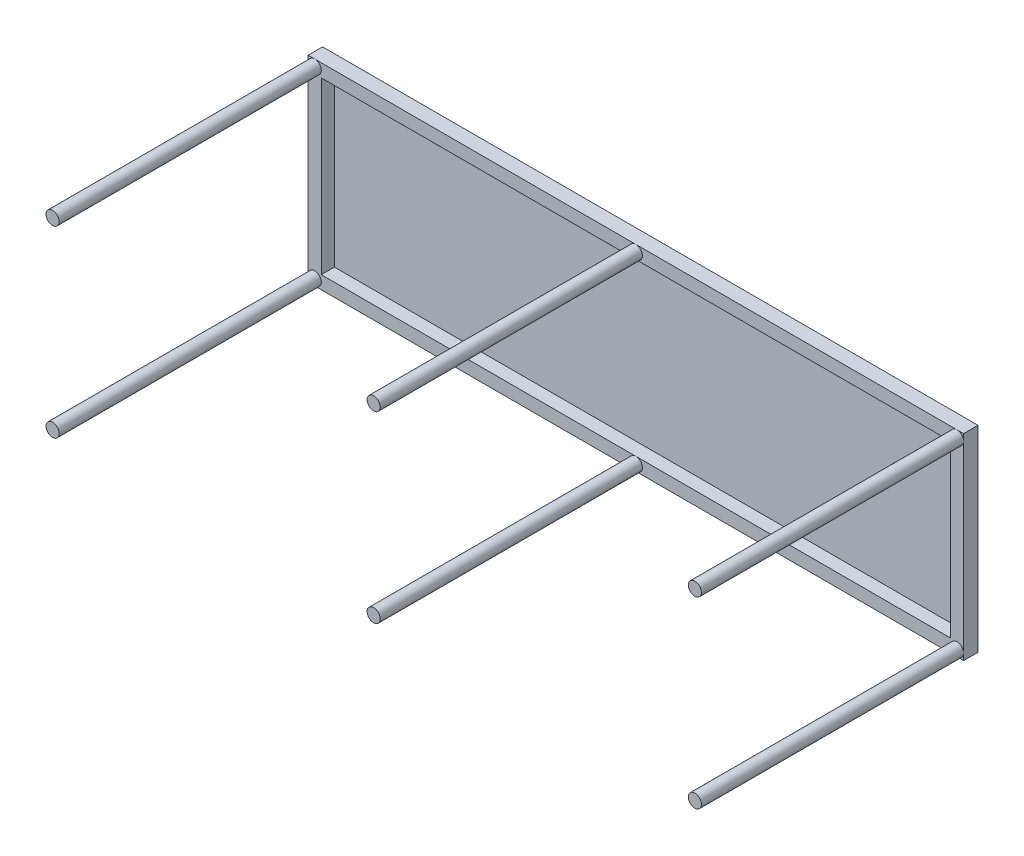
ISO-10303-21;
HEADER;
FILE_DESCRIPTION(('STEP AP214'),'2;1');
FILE_NAME('part.step','',(''),(''),'','','');
FILE_SCHEMA(('AUTOMOTIVE_DESIGN { 1 0 10303 214 1 1 1 1 }'));
ENDSEC;
DATA;
#1=APPLICATION_CONTEXT('core data for automotive mechanical design processes');
#2=APPLICATION_PROTOCOL_DEFINITION('international standard','automotive_design',2000,#1);
#3=PRODUCT_CONTEXT('',#1,'mechanical');
#4=PRODUCT('Part','Part','',(#3));
#5=PRODUCT_RELATED_PRODUCT_CATEGORY('part','',(#4));
#6=PRODUCT_DEFINITION_FORMATION('','',#4);
#7=PRODUCT_DEFINITION_CONTEXT('part definition',#1,'design');
#8=PRODUCT_DEFINITION('design','',#6,#7);
#9=PRODUCT_DEFINITION_SHAPE('','',#8);
#10=(LENGTH_UNIT() NAMED_UNIT(*) SI_UNIT(.MILLI.,.METRE.));
#11=(NAMED_UNIT(*) PLANE_ANGLE_UNIT() SI_UNIT($,.RADIAN.));
#12=(NAMED_UNIT(*) SI_UNIT($,.STERADIAN.) SOLID_ANGLE_UNIT());
#13=UNCERTAINTY_MEASURE_WITH_UNIT(LENGTH_MEASURE(1.E-05),#10,'distance_accuracy_value','');
#14=(GEOMETRIC_REPRESENTATION_CONTEXT(3) GLOBAL_UNCERTAINTY_ASSIGNED_CONTEXT((#13)) GLOBAL_UNIT_ASSIGNED_CONTEXT((#10,
#11,#12)) REPRESENTATION_CONTEXT('',''));
#15=CARTESIAN_POINT('',(0.,0.,0.));
#16=DIRECTION('',(0.,0.,1.));
#17=DIRECTION('',(1.,0.,0.));
#18=AXIS2_PLACEMENT_3D('',#15,#16,#17);
#19=CARTESIAN_POINT('',(0.,0.,110.));
#20=DIRECTION('',(0.,0.,1.));
#21=DIRECTION('',(1.,0.,0.));
#22=AXIS2_PLACEMENT_3D('',#19,#20,#21);
#23=PLANE('',#22);
#24=DIRECTION('',(1.,0.,0.));
#25=VECTOR('',#24,1.);
#26=CARTESIAN_POINT('',(-59.0364120135364,-1472.78417935702,110.));
#27=LINE('',#26,#25);
#28=CARTESIAN_POINT('',(-9.03641201353637,-1472.78417935702,110.));
#29=VERTEX_POINT('',#28);
#30=CARTESIAN_POINT('',(2440.96358798646,-1472.78417935702,110.));
#31=VERTEX_POINT('',#30);
#32=EDGE_CURVE('E144',#29,#31,#27,.T.);
#33=ORIENTED_EDGE('',*,*,#32,.T.);
#34=CARTESIAN_POINT('',(2440.96358798646,-1422.78417935702,110.));
#35=DIRECTION('',(0.,0.,1.));
#36=DIRECTION('',(1.,0.,0.));
#37=AXIS2_PLACEMENT_3D('',#34,#35,#36);
#38=CIRCLE('',#37,50.);
#39=CARTESIAN_POINT('',(2440.96358798646,-1372.78417935702,110.));
#40=VERTEX_POINT('',#39);
#41=EDGE_CURVE('E46',#40,#31,#38,.T.);
#42=ORIENTED_EDGE('',*,*,#41,.F.);
#43=DIRECTION('',(1.,0.,0.));
#44=VECTOR('',#43,1.);
#45=CARTESIAN_POINT('',(40.9635879864636,-1372.78417935702,110.));
#46=LINE('',#45,#44);
#47=CARTESIAN_POINT('',(40.9635879864636,-1372.78417935702,110.));
#48=VERTEX_POINT('',#47);
#49=EDGE_CURVE('E142',#48,#40,#46,.T.);
#50=ORIENTED_EDGE('',*,*,#49,.F.);
#51=DIRECTION('',(0.,-1.,0.));
#52=VECTOR('',#51,1.);
#53=CARTESIAN_POINT('',(40.9635879864636,-72.784179357022,110.));
#54=LINE('',#53,#52);
#55=CARTESIAN_POINT('',(40.9635879864636,-72.784179357022,110.));
#56=VERTEX_POINT('',#55);
#57=EDGE_CURVE('E155',#56,#48,#54,.T.);
#58=ORIENTED_EDGE('',*,*,#57,.F.);
#59=DIRECTION('',(-1.,0.,0.));
#60=VECTOR('',#59,1.);
#61=CARTESIAN_POINT('',(40.9635879864636,-72.784179357022,110.));
#62=LINE('',#61,#60);
#63=CARTESIAN_POINT('',(2440.96358798646,-72.784179357022,110.));
#64=VERTEX_POINT('',#63);
#65=EDGE_CURVE('E162',#64,#56,#62,.T.);
#66=ORIENTED_EDGE('',*,*,#65,.F.);
#67=CARTESIAN_POINT('',(2440.96358798646,-22.784179357022,110.));
#68=DIRECTION('',(0.,0.,1.));
#69=DIRECTION('',(1.,0.,0.));
#70=AXIS2_PLACEMENT_3D('',#67,#68,#69);
#71=CIRCLE('',#70,50.);
#72=CARTESIAN_POINT('',(2440.96358798646,27.215820642978,110.));
#73=VERTEX_POINT('',#72);
#74=EDGE_CURVE('E53',#73,#64,#71,.T.);
#75=ORIENTED_EDGE('',*,*,#74,.F.);
#76=DIRECTION('',(-1.,0.,0.));
#77=VECTOR('',#76,1.);
#78=CARTESIAN_POINT('',(-59.0364120135364,27.215820642978,110.));
#79=LINE('',#78,#77);
#80=CARTESIAN_POINT('',(-9.03641201353637,27.215820642978,110.));
#81=VERTEX_POINT('',#80);
#82=EDGE_CURVE('E209',#73,#81,#79,.T.);
#83=ORIENTED_EDGE('',*,*,#82,.T.);
#84=CARTESIAN_POINT('',(-9.03641201353637,-22.784179357022,110.));
#85=DIRECTION('',(0.,0.,1.));
#86=DIRECTION('',(1.,0.,0.));
#87=AXIS2_PLACEMENT_3D('',#84,#85,#86);
#88=CIRCLE('',#87,50.);
#89=CARTESIAN_POINT('',(-59.0364120135364,-22.784179357022,110.));
#90=VERTEX_POINT('',#89);
#91=EDGE_CURVE('E40',#90,#81,#88,.T.);
#92=ORIENTED_EDGE('',*,*,#91,.F.);
#93=DIRECTION('',(0.,-1.,0.));
#94=VECTOR('',#93,1.);
#95=CARTESIAN_POINT('',(-59.0364120135364,27.215820642978,110.));
#96=LINE('',#95,#94);
#97=CARTESIAN_POINT('',(-59.0364120135364,-1422.78417935702,110.));
#98=VERTEX_POINT('',#97);
#99=EDGE_CURVE('E193',#90,#98,#96,.T.);
#100=ORIENTED_EDGE('',*,*,#99,.T.);
#101=CARTESIAN_POINT('',(-9.03641201353637,-1422.78417935702,110.));
#102=DIRECTION('',(0.,0.,1.));
#103=DIRECTION('',(1.,0.,0.));
#104=AXIS2_PLACEMENT_3D('',#101,#102,#103);
#105=CIRCLE('',#104,50.);
#106=EDGE_CURVE('E11',#98,#29,#105,.F.);
#107=ORIENTED_EDGE('',*,*,#106,.T.);
#108=EDGE_LOOP('',(#33,#42,#50,#58,#66,#75,#83,#92,#100,#107));
#109=FACE_BOUND('',#108,.T.);
#110=ADVANCED_FACE('F32',(#109),#23,.T.);
#111=CARTESIAN_POINT('',(4840.96358798646,-1372.78417935702,110.));
#112=VERTEX_POINT('',#111);
#113=EDGE_CURVE('E147',#40,#112,#46,.T.);
#114=ORIENTED_EDGE('',*,*,#113,.F.);
#115=EDGE_CURVE('E130',#31,#40,#38,.T.);
#116=ORIENTED_EDGE('',*,*,#115,.F.);
#117=CARTESIAN_POINT('',(4890.96358798646,-1472.78417935702,110.));
#118=VERTEX_POINT('',#117);
#119=EDGE_CURVE('E198',#31,#118,#27,.T.);
#120=ORIENTED_EDGE('',*,*,#119,.T.);
#121=CARTESIAN_POINT('',(4890.96358798646,-1422.78417935702,110.));
#122=DIRECTION('',(0.,0.,1.));
#123=DIRECTION('',(1.,0.,0.));
#124=AXIS2_PLACEMENT_3D('',#121,#122,#123);
#125=CIRCLE('',#124,50.);
#126=CARTESIAN_POINT('',(4940.96358798646,-1422.78417935702,110.));
#127=VERTEX_POINT('',#126);
#128=EDGE_CURVE('E247',#127,#118,#125,.T.);
#129=ORIENTED_EDGE('',*,*,#128,.F.);
#130=DIRECTION('',(0.,1.,0.));
#131=VECTOR('',#130,1.);
#132=CARTESIAN_POINT('',(4940.96358798646,27.215820642978,110.));
#133=LINE('',#132,#131);
#134=CARTESIAN_POINT('',(4940.96358798646,-22.784179357022,110.));
#135=VERTEX_POINT('',#134);
#136=EDGE_CURVE('E203',#127,#135,#133,.T.);
#137=ORIENTED_EDGE('',*,*,#136,.T.);
#138=CARTESIAN_POINT('',(4890.96358798646,-22.784179357022,110.));
#139=DIRECTION('',(0.,0.,1.));
#140=DIRECTION('',(1.,0.,0.));
#141=AXIS2_PLACEMENT_3D('',#138,#139,#140);
#142=CIRCLE('',#141,50.);
#143=CARTESIAN_POINT('',(4890.96358798646,27.215820642978,110.));
#144=VERTEX_POINT('',#143);
#145=EDGE_CURVE('E256',#144,#135,#142,.T.);
#146=ORIENTED_EDGE('',*,*,#145,.F.);
#147=EDGE_CURVE('E208',#144,#73,#79,.T.);
#148=ORIENTED_EDGE('',*,*,#147,.T.);
#149=EDGE_CURVE('E263',#64,#73,#71,.T.);
#150=ORIENTED_EDGE('',*,*,#149,.F.);
#151=CARTESIAN_POINT('',(4840.96358798646,-72.784179357022,110.));
#152=VERTEX_POINT('',#151);
#153=EDGE_CURVE('E167',#152,#64,#62,.T.);
#154=ORIENTED_EDGE('',*,*,#153,.F.);
#155=DIRECTION('',(0.,1.,0.));
#156=VECTOR('',#155,1.);
#157=CARTESIAN_POINT('',(4840.96358798646,-72.784179357022,110.));
#158=LINE('',#157,#156);
#159=EDGE_CURVE('E151',#112,#152,#158,.T.);
#160=ORIENTED_EDGE('',*,*,#159,.F.);
#161=EDGE_LOOP('',(#114,#116,#120,#129,#137,#146,#148,#150,#154,#160));
#162=FACE_BOUND('',#161,.T.);
#163=ADVANCED_FACE('F148',(#162),#23,.T.);
#164=CARTESIAN_POINT('',(4940.96358798646,27.215820642978,110.));
#165=VERTEX_POINT('',#164);
#166=EDGE_CURVE('E204',#165,#144,#79,.T.);
#167=ORIENTED_EDGE('',*,*,#166,.T.);
#168=EDGE_CURVE('E253',#135,#144,#142,.T.);
#169=ORIENTED_EDGE('',*,*,#168,.F.);
#170=EDGE_CURVE('E197',#135,#165,#133,.T.);
#171=ORIENTED_EDGE('',*,*,#170,.T.);
#172=EDGE_LOOP('',(#167,#169,#171));
#173=FACE_BOUND('',#172,.T.);
#174=ADVANCED_FACE('F308',(#173),#23,.T.);
#175=CARTESIAN_POINT('',(4940.96358798646,-1472.78417935702,110.));
#176=VERTEX_POINT('',#175);
#177=EDGE_CURVE('E199',#176,#127,#133,.T.);
#178=ORIENTED_EDGE('',*,*,#177,.T.);
#179=EDGE_CURVE('E250',#118,#127,#125,.T.);
#180=ORIENTED_EDGE('',*,*,#179,.F.);
#181=EDGE_CURVE('E192',#118,#176,#27,.T.);
#182=ORIENTED_EDGE('',*,*,#181,.T.);
#183=EDGE_LOOP('',(#178,#180,#182));
#184=FACE_BOUND('',#183,.T.);
#185=ADVANCED_FACE('F297',(#184),#23,.T.);
#186=CARTESIAN_POINT('',(-59.0364120135364,-1472.78417935702,110.));
#187=VERTEX_POINT('',#186);
#188=EDGE_CURVE('E194',#187,#29,#27,.T.);
#189=ORIENTED_EDGE('',*,*,#188,.T.);
#190=CARTESIAN_POINT('',(-9.03641201353637,-1422.78417935702,110.));
#191=DIRECTION('',(0.,0.,1.));
#192=DIRECTION('',(1.,0.,0.));
#193=AXIS2_PLACEMENT_3D('',#190,#191,#192);
#194=CIRCLE('',#193,50.);
#195=EDGE_CURVE('E240',#98,#29,#194,.T.);
#196=ORIENTED_EDGE('',*,*,#195,.F.);
#197=EDGE_CURVE('E188',#98,#187,#96,.T.);
#198=ORIENTED_EDGE('',*,*,#197,.T.);
#199=EDGE_LOOP('',(#189,#196,#198));
#200=FACE_BOUND('',#199,.T.);
#201=ADVANCED_FACE('F291',(#200),#23,.T.);
#202=EDGE_CURVE('E232',#81,#90,#88,.T.);
#203=ORIENTED_EDGE('',*,*,#202,.F.);
#204=CARTESIAN_POINT('',(-59.0364120135364,27.215820642978,110.));
#205=VERTEX_POINT('',#204);
#206=EDGE_CURVE('E202',#81,#205,#79,.T.);
#207=ORIENTED_EDGE('',*,*,#206,.T.);
#208=EDGE_CURVE('E189',#205,#90,#96,.T.);
#209=ORIENTED_EDGE('',*,*,#208,.T.);
#210=EDGE_LOOP('',(#203,#207,#209));
#211=FACE_BOUND('',#210,.T.);
#212=ADVANCED_FACE('F281',(#211),#23,.T.);
#213=CARTESIAN_POINT('',(-59.0364120135364,27.215820642978,10.));
#214=DIRECTION('',(1.,0.,0.));
#215=DIRECTION('',(0.,1.,0.));
#216=AXIS2_PLACEMENT_3D('',#213,#214,#215);
#217=PLANE('',#216);
#218=DIRECTION('',(0.,-1.,0.));
#219=VECTOR('',#218,1.);
#220=CARTESIAN_POINT('',(-59.0364120135364,27.215820642978,0.));
#221=LINE('',#220,#219);
#222=CARTESIAN_POINT('',(-59.0364120135364,27.215820642978,0.));
#223=VERTEX_POINT('',#222);
#224=CARTESIAN_POINT('',(-59.0364120135362,-1472.78417935702,0.));
#225=VERTEX_POINT('',#224);
#226=EDGE_CURVE('E207',#223,#225,#221,.T.);
#227=ORIENTED_EDGE('',*,*,#226,.T.);
#228=DIRECTION('',(0.,0.,-1.));
#229=VECTOR('',#228,1.);
#230=CARTESIAN_POINT('',(-59.0364120135362,-1472.78417935702,10.));
#231=LINE('',#230,#229);
#232=EDGE_CURVE('E226',#187,#225,#231,.T.);
#233=ORIENTED_EDGE('',*,*,#232,.F.);
#234=ORIENTED_EDGE('',*,*,#197,.F.);
#235=ORIENTED_EDGE('',*,*,#99,.F.);
#236=ORIENTED_EDGE('',*,*,#208,.F.);
#237=DIRECTION('',(0.,0.,-1.));
#238=VECTOR('',#237,1.);
#239=CARTESIAN_POINT('',(-59.0364120135364,27.215820642978,10.));
#240=LINE('',#239,#238);
#241=EDGE_CURVE('E218',#205,#223,#240,.T.);
#242=ORIENTED_EDGE('',*,*,#241,.T.);
#243=EDGE_LOOP('',(#227,#233,#234,#235,#236,#242));
#244=FACE_BOUND('',#243,.T.);
#245=ADVANCED_FACE('F34',(#244),#217,.F.);
#246=CARTESIAN_POINT('',(-59.0364120135362,-1472.78417935702,10.));
#247=DIRECTION('',(0.,1.,0.));
#248=DIRECTION('',(0.,0.,1.));
#249=AXIS2_PLACEMENT_3D('',#246,#247,#248);
#250=PLANE('',#249);
#251=DIRECTION('',(1.,0.,0.));
#252=VECTOR('',#251,1.);
#253=CARTESIAN_POINT('',(-59.0364120135362,-1472.78417935702,0.));
#254=LINE('',#253,#252);
#255=CARTESIAN_POINT('',(4940.96358798646,-1472.78417935702,0.));
#256=VERTEX_POINT('',#255);
#257=EDGE_CURVE('E212',#225,#256,#254,.T.);
#258=ORIENTED_EDGE('',*,*,#257,.T.);
#259=DIRECTION('',(0.,0.,-1.));
#260=VECTOR('',#259,1.);
#261=CARTESIAN_POINT('',(4940.96358798646,-1472.78417935702,10.));
#262=LINE('',#261,#260);
#263=EDGE_CURVE('E224',#176,#256,#262,.T.);
#264=ORIENTED_EDGE('',*,*,#263,.F.);
#265=ORIENTED_EDGE('',*,*,#181,.F.);
#266=ORIENTED_EDGE('',*,*,#119,.F.);
#267=ORIENTED_EDGE('',*,*,#32,.F.);
#268=ORIENTED_EDGE('',*,*,#188,.F.);
#269=ORIENTED_EDGE('',*,*,#232,.T.);
#270=EDGE_LOOP('',(#258,#264,#265,#266,#267,#268,#269));
#271=FACE_BOUND('',#270,.T.);
#272=ADVANCED_FACE('F292',(#271),#250,.F.);
#273=CARTESIAN_POINT('',(4940.96358798646,27.215820642978,10.));
#274=DIRECTION('',(-1.,0.,0.));
#275=DIRECTION('',(0.,0.,1.));
#276=AXIS2_PLACEMENT_3D('',#273,#274,#275);
#277=PLANE('',#276);
#278=DIRECTION('',(0.,1.,0.));
#279=VECTOR('',#278,1.);
#280=CARTESIAN_POINT('',(4940.96358798646,27.215820642978,0.));
#281=LINE('',#280,#279);
#282=CARTESIAN_POINT('',(4940.96358798646,27.215820642978,0.));
#283=VERTEX_POINT('',#282);
#284=EDGE_CURVE('E214',#256,#283,#281,.T.);
#285=ORIENTED_EDGE('',*,*,#284,.T.);
#286=DIRECTION('',(0.,0.,-1.));
#287=VECTOR('',#286,1.);
#288=CARTESIAN_POINT('',(4940.96358798646,27.215820642978,10.));
#289=LINE('',#288,#287);
#290=EDGE_CURVE('E221',#165,#283,#289,.T.);
#291=ORIENTED_EDGE('',*,*,#290,.F.);
#292=ORIENTED_EDGE('',*,*,#170,.F.);
#293=ORIENTED_EDGE('',*,*,#136,.F.);
#294=ORIENTED_EDGE('',*,*,#177,.F.);
#295=ORIENTED_EDGE('',*,*,#263,.T.);
#296=EDGE_LOOP('',(#285,#291,#292,#293,#294,#295));
#297=FACE_BOUND('',#296,.T.);
#298=ADVANCED_FACE('F302',(#297),#277,.F.);
#299=CARTESIAN_POINT('',(-59.0364120135364,27.215820642978,10.));
#300=DIRECTION('',(0.,-1.,0.));
#301=DIRECTION('',(0.,0.,-1.));
#302=AXIS2_PLACEMENT_3D('',#299,#300,#301);
#303=PLANE('',#302);
#304=DIRECTION('',(-1.,0.,0.));
#305=VECTOR('',#304,1.);
#306=CARTESIAN_POINT('',(-59.0364120135364,27.215820642978,0.));
#307=LINE('',#306,#305);
#308=EDGE_CURVE('E216',#283,#223,#307,.T.);
#309=ORIENTED_EDGE('',*,*,#308,.T.);
#310=ORIENTED_EDGE('',*,*,#241,.F.);
#311=ORIENTED_EDGE('',*,*,#206,.F.);
#312=ORIENTED_EDGE('',*,*,#82,.F.);
#313=ORIENTED_EDGE('',*,*,#147,.F.);
#314=ORIENTED_EDGE('',*,*,#166,.F.);
#315=ORIENTED_EDGE('',*,*,#290,.T.);
#316=EDGE_LOOP('',(#309,#310,#311,#312,#313,#314,#315));
#317=FACE_BOUND('',#316,.T.);
#318=ADVANCED_FACE('F275',(#317),#303,.F.);
#319=CARTESIAN_POINT('',(0.,0.,0.));
#320=DIRECTION('',(0.,0.,1.));
#321=DIRECTION('',(1.,0.,0.));
#322=AXIS2_PLACEMENT_3D('',#319,#320,#321);
#323=PLANE('',#322);
#324=ORIENTED_EDGE('',*,*,#226,.F.);
#325=ORIENTED_EDGE('',*,*,#308,.F.);
#326=ORIENTED_EDGE('',*,*,#284,.F.);
#327=ORIENTED_EDGE('',*,*,#257,.F.);
#328=EDGE_LOOP('',(#324,#325,#326,#327));
#329=FACE_BOUND('',#328,.T.);
#330=ADVANCED_FACE('F310',(#329),#323,.F.);
#331=CARTESIAN_POINT('',(40.9635879864636,-72.784179357022,110.));
#332=DIRECTION('',(1.,0.,0.));
#333=DIRECTION('',(0.,0.,-1.));
#334=AXIS2_PLACEMENT_3D('',#331,#332,#333);
#335=PLANE('',#334);
#336=DIRECTION('',(0.,-1.,0.));
#337=VECTOR('',#336,1.);
#338=CARTESIAN_POINT('',(40.9635879864636,-72.784179357022,10.));
#339=LINE('',#338,#337);
#340=CARTESIAN_POINT('',(40.9635879864636,-72.784179357022,10.));
#341=VERTEX_POINT('',#340);
#342=CARTESIAN_POINT('',(40.9635879864636,-1372.78417935702,10.));
#343=VERTEX_POINT('',#342);
#344=EDGE_CURVE('E171',#341,#343,#339,.T.);
#345=ORIENTED_EDGE('',*,*,#344,.F.);
#346=DIRECTION('',(0.,0.,-1.));
#347=VECTOR('',#346,1.);
#348=CARTESIAN_POINT('',(40.9635879864636,-72.784179357022,110.));
#349=LINE('',#348,#347);
#350=EDGE_CURVE('E170',#56,#341,#349,.T.);
#351=ORIENTED_EDGE('',*,*,#350,.F.);
#352=ORIENTED_EDGE('',*,*,#57,.T.);
#353=DIRECTION('',(0.,0.,-1.));
#354=VECTOR('',#353,1.);
#355=CARTESIAN_POINT('',(40.9635879864636,-1372.78417935702,110.));
#356=LINE('',#355,#354);
#357=EDGE_CURVE('E161',#48,#343,#356,.T.);
#358=ORIENTED_EDGE('',*,*,#357,.T.);
#359=EDGE_LOOP('',(#345,#351,#352,#358));
#360=FACE_BOUND('',#359,.T.);
#361=ADVANCED_FACE('F312',(#360),#335,.T.);
#362=CARTESIAN_POINT('',(40.9635879864636,-1372.78417935702,110.));
#363=DIRECTION('',(0.,1.,0.));
#364=DIRECTION('',(0.,0.,1.));
#365=AXIS2_PLACEMENT_3D('',#362,#363,#364);
#366=PLANE('',#365);
#367=DIRECTION('',(1.,0.,0.));
#368=VECTOR('',#367,1.);
#369=CARTESIAN_POINT('',(40.9635879864636,-1372.78417935702,10.));
#370=LINE('',#369,#368);
#371=CARTESIAN_POINT('',(4840.96358798646,-1372.78417935702,10.));
#372=VERTEX_POINT('',#371);
#373=EDGE_CURVE('E173',#343,#372,#370,.T.);
#374=ORIENTED_EDGE('',*,*,#373,.F.);
#375=ORIENTED_EDGE('',*,*,#357,.F.);
#376=ORIENTED_EDGE('',*,*,#49,.T.);
#377=ORIENTED_EDGE('',*,*,#113,.T.);
#378=DIRECTION('',(0.,0.,-1.));
#379=VECTOR('',#378,1.);
#380=CARTESIAN_POINT('',(4840.96358798646,-1372.78417935702,110.));
#381=LINE('',#380,#379);
#382=EDGE_CURVE('E185',#112,#372,#381,.T.);
#383=ORIENTED_EDGE('',*,*,#382,.T.);
#384=EDGE_LOOP('',(#374,#375,#376,#377,#383));
#385=FACE_BOUND('',#384,.T.);
#386=ADVANCED_FACE('F159',(#385),#366,.T.);
#387=CARTESIAN_POINT('',(4840.96358798646,-72.784179357022,110.));
#388=DIRECTION('',(-1.,0.,0.));
#389=DIRECTION('',(0.,0.,1.));
#390=AXIS2_PLACEMENT_3D('',#387,#388,#389);
#391=PLANE('',#390);
#392=DIRECTION('',(0.,1.,0.));
#393=VECTOR('',#392,1.);
#394=CARTESIAN_POINT('',(4840.96358798646,-72.784179357022,10.));
#395=LINE('',#394,#393);
#396=CARTESIAN_POINT('',(4840.96358798646,-72.784179357022,10.));
#397=VERTEX_POINT('',#396);
#398=EDGE_CURVE('E176',#372,#397,#395,.T.);
#399=ORIENTED_EDGE('',*,*,#398,.F.);
#400=ORIENTED_EDGE('',*,*,#382,.F.);
#401=ORIENTED_EDGE('',*,*,#159,.T.);
#402=DIRECTION('',(0.,0.,-1.));
#403=VECTOR('',#402,1.);
#404=CARTESIAN_POINT('',(4840.96358798646,-72.784179357022,110.));
#405=LINE('',#404,#403);
#406=EDGE_CURVE('E182',#152,#397,#405,.T.);
#407=ORIENTED_EDGE('',*,*,#406,.T.);
#408=EDGE_LOOP('',(#399,#400,#401,#407));
#409=FACE_BOUND('',#408,.T.);
#410=ADVANCED_FACE('F375',(#409),#391,.T.);
#411=CARTESIAN_POINT('',(40.9635879864636,-72.784179357022,110.));
#412=DIRECTION('',(0.,-1.,0.));
#413=DIRECTION('',(0.,0.,-1.));
#414=AXIS2_PLACEMENT_3D('',#411,#412,#413);
#415=PLANE('',#414);
#416=DIRECTION('',(-1.,0.,0.));
#417=VECTOR('',#416,1.);
#418=CARTESIAN_POINT('',(40.9635879864636,-72.784179357022,10.));
#419=LINE('',#418,#417);
#420=EDGE_CURVE('E178',#397,#341,#419,.T.);
#421=ORIENTED_EDGE('',*,*,#420,.F.);
#422=ORIENTED_EDGE('',*,*,#406,.F.);
#423=ORIENTED_EDGE('',*,*,#153,.T.);
#424=ORIENTED_EDGE('',*,*,#65,.T.);
#425=ORIENTED_EDGE('',*,*,#350,.T.);
#426=EDGE_LOOP('',(#421,#422,#423,#424,#425));
#427=FACE_BOUND('',#426,.T.);
#428=ADVANCED_FACE('F382',(#427),#415,.T.);
#429=CARTESIAN_POINT('',(0.,0.,10.));
#430=DIRECTION('',(0.,0.,1.));
#431=DIRECTION('',(1.,0.,0.));
#432=AXIS2_PLACEMENT_3D('',#429,#430,#431);
#433=PLANE('',#432);
#434=ORIENTED_EDGE('',*,*,#344,.T.);
#435=ORIENTED_EDGE('',*,*,#373,.T.);
#436=ORIENTED_EDGE('',*,*,#398,.T.);
#437=ORIENTED_EDGE('',*,*,#420,.T.);
#438=EDGE_LOOP('',(#434,#435,#436,#437));
#439=FACE_BOUND('',#438,.T.);
#440=ADVANCED_FACE('F387',(#439),#433,.T.);
#441=CARTESIAN_POINT('',(-9.03641201353637,-22.784179357022,2110.));
#442=DIRECTION('',(0.,0.,-1.));
#443=DIRECTION('',(-1.,0.,0.));
#444=AXIS2_PLACEMENT_3D('',#441,#442,#443);
#445=CYLINDRICAL_SURFACE('',#444,50.);
#446=CARTESIAN_POINT('',(-9.03641201353637,-22.784179357022,2110.));
#447=DIRECTION('',(0.,0.,1.));
#448=DIRECTION('',(1.,0.,0.));
#449=AXIS2_PLACEMENT_3D('',#446,#447,#448);
#450=CIRCLE('',#449,50.);
#451=CARTESIAN_POINT('',(40.9635879864636,-22.784179357022,2110.));
#452=VERTEX_POINT('',#451);
#453=EDGE_CURVE('E174',#452,#452,#450,.T.);
#454=ORIENTED_EDGE('',*,*,#453,.F.);
#455=EDGE_LOOP('',(#454));
#456=FACE_BOUND('',#455,.T.);
#457=ORIENTED_EDGE('',*,*,#202,.T.);
#458=ORIENTED_EDGE('',*,*,#91,.T.);
#459=EDGE_LOOP('',(#457,#458));
#460=FACE_BOUND('',#459,.T.);
#461=ADVANCED_FACE('F456',(#456,#460),#445,.T.);
#462=CARTESIAN_POINT('',(-9.03641201353637,-22.784179357022,2110.));
#463=DIRECTION('',(0.,0.,1.));
#464=DIRECTION('',(1.,0.,0.));
#465=AXIS2_PLACEMENT_3D('',#462,#463,#464);
#466=PLANE('',#465);
#467=ORIENTED_EDGE('',*,*,#453,.T.);
#468=EDGE_LOOP('',(#467));
#469=FACE_BOUND('',#468,.T.);
#470=ADVANCED_FACE('F452',(#469),#466,.T.);
#471=CARTESIAN_POINT('',(-9.03641201353637,-1422.78417935702,2110.));
#472=DIRECTION('',(0.,0.,-1.));
#473=DIRECTION('',(-1.,0.,0.));
#474=AXIS2_PLACEMENT_3D('',#471,#472,#473);
#475=CYLINDRICAL_SURFACE('',#474,50.);
#476=CARTESIAN_POINT('',(-9.03641201353637,-1422.78417935702,2110.));
#477=DIRECTION('',(0.,0.,1.));
#478=DIRECTION('',(1.,0.,0.));
#479=AXIS2_PLACEMENT_3D('',#476,#477,#478);
#480=CIRCLE('',#479,50.);
#481=CARTESIAN_POINT('',(40.9635879864636,-1422.78417935702,2110.));
#482=VERTEX_POINT('',#481);
#483=EDGE_CURVE('E236',#482,#482,#480,.T.);
#484=ORIENTED_EDGE('',*,*,#483,.F.);
#485=EDGE_LOOP('',(#484));
#486=FACE_BOUND('',#485,.T.);
#487=ORIENTED_EDGE('',*,*,#195,.T.);
#488=ORIENTED_EDGE('',*,*,#106,.F.);
#489=EDGE_LOOP('',(#487,#488));
#490=FACE_BOUND('',#489,.T.);
#491=ADVANCED_FACE('F449',(#486,#490),#475,.T.);
#492=CARTESIAN_POINT('',(-9.03641201353637,-1422.78417935702,2110.));
#493=DIRECTION('',(0.,0.,1.));
#494=DIRECTION('',(1.,0.,0.));
#495=AXIS2_PLACEMENT_3D('',#492,#493,#494);
#496=PLANE('',#495);
#497=ORIENTED_EDGE('',*,*,#483,.T.);
#498=EDGE_LOOP('',(#497));
#499=FACE_BOUND('',#498,.T.);
#500=ADVANCED_FACE('F445',(#499),#496,.T.);
#501=CARTESIAN_POINT('',(4890.96358798646,-1422.78417935702,2110.));
#502=DIRECTION('',(0.,0.,-1.));
#503=DIRECTION('',(-1.,0.,0.));
#504=AXIS2_PLACEMENT_3D('',#501,#502,#503);
#505=CYLINDRICAL_SURFACE('',#504,50.);
#506=CARTESIAN_POINT('',(4890.96358798646,-1422.78417935702,2110.));
#507=DIRECTION('',(0.,0.,1.));
#508=DIRECTION('',(1.,0.,0.));
#509=AXIS2_PLACEMENT_3D('',#506,#507,#508);
#510=CIRCLE('',#509,50.);
#511=CARTESIAN_POINT('',(4940.96358798646,-1422.78417935702,2110.));
#512=VERTEX_POINT('',#511);
#513=EDGE_CURVE('E244',#512,#512,#510,.T.);
#514=ORIENTED_EDGE('',*,*,#513,.F.);
#515=EDGE_LOOP('',(#514));
#516=FACE_BOUND('',#515,.T.);
#517=ORIENTED_EDGE('',*,*,#128,.T.);
#518=ORIENTED_EDGE('',*,*,#179,.T.);
#519=EDGE_LOOP('',(#517,#518));
#520=FACE_BOUND('',#519,.T.);
#521=ADVANCED_FACE('F441',(#516,#520),#505,.T.);
#522=CARTESIAN_POINT('',(4890.96358798646,-1422.78417935702,2110.));
#523=DIRECTION('',(0.,0.,1.));
#524=DIRECTION('',(1.,0.,0.));
#525=AXIS2_PLACEMENT_3D('',#522,#523,#524);
#526=PLANE('',#525);
#527=ORIENTED_EDGE('',*,*,#513,.T.);
#528=EDGE_LOOP('',(#527));
#529=FACE_BOUND('',#528,.T.);
#530=ADVANCED_FACE('F437',(#529),#526,.T.);
#531=CARTESIAN_POINT('',(4890.96358798646,-22.784179357022,2110.));
#532=DIRECTION('',(0.,0.,-1.));
#533=DIRECTION('',(-1.,0.,0.));
#534=AXIS2_PLACEMENT_3D('',#531,#532,#533);
#535=CYLINDRICAL_SURFACE('',#534,50.);
#536=CARTESIAN_POINT('',(4890.96358798646,-22.784179357022,2110.));
#537=DIRECTION('',(0.,0.,1.));
#538=DIRECTION('',(1.,0.,0.));
#539=AXIS2_PLACEMENT_3D('',#536,#537,#538);
#540=CIRCLE('',#539,50.);
#541=CARTESIAN_POINT('',(4940.96358798646,-22.784179357022,2110.));
#542=VERTEX_POINT('',#541);
#543=EDGE_CURVE('E255',#542,#542,#540,.T.);
#544=ORIENTED_EDGE('',*,*,#543,.F.);
#545=EDGE_LOOP('',(#544));
#546=FACE_BOUND('',#545,.T.);
#547=ORIENTED_EDGE('',*,*,#168,.T.);
#548=ORIENTED_EDGE('',*,*,#145,.T.);
#549=EDGE_LOOP('',(#547,#548));
#550=FACE_BOUND('',#549,.T.);
#551=ADVANCED_FACE('F433',(#546,#550),#535,.T.);
#552=CARTESIAN_POINT('',(4890.96358798646,-22.784179357022,2110.));
#553=DIRECTION('',(0.,0.,1.));
#554=DIRECTION('',(1.,0.,0.));
#555=AXIS2_PLACEMENT_3D('',#552,#553,#554);
#556=PLANE('',#555);
#557=ORIENTED_EDGE('',*,*,#543,.T.);
#558=EDGE_LOOP('',(#557));
#559=FACE_BOUND('',#558,.T.);
#560=ADVANCED_FACE('F400',(#559),#556,.T.);
#561=CARTESIAN_POINT('',(2440.96358798646,-22.784179357022,2251.42135623731));
#562=DIRECTION('',(0.,0.,-1.));
#563=DIRECTION('',(-1.,0.,0.));
#564=AXIS2_PLACEMENT_3D('',#561,#562,#563);
#565=CYLINDRICAL_SURFACE('',#564,50.);
#566=ORIENTED_EDGE('',*,*,#74,.T.);
#567=ORIENTED_EDGE('',*,*,#149,.T.);
#568=EDGE_LOOP('',(#566,#567));
#569=FACE_BOUND('',#568,.T.);
#570=CARTESIAN_POINT('',(2440.96358798646,-22.784179357022,2110.));
#571=DIRECTION('',(0.,0.,1.));
#572=DIRECTION('',(1.,0.,0.));
#573=AXIS2_PLACEMENT_3D('',#570,#571,#572);
#574=CIRCLE('',#573,50.);
#575=CARTESIAN_POINT('',(2490.96358798646,-22.784179357022,2110.));
#576=VERTEX_POINT('',#575);
#577=EDGE_CURVE('E259',#576,#576,#574,.T.);
#578=ORIENTED_EDGE('',*,*,#577,.F.);
#579=EDGE_LOOP('',(#578));
#580=FACE_BOUND('',#579,.T.);
#581=ADVANCED_FACE('F267',(#569,#580),#565,.T.);
#582=CARTESIAN_POINT('',(-9.03641201353637,-1422.78417935702,2110.));
#583=DIRECTION('',(0.,0.,1.));
#584=DIRECTION('',(1.,0.,0.));
#585=AXIS2_PLACEMENT_3D('',#582,#583,#584);
#586=PLANE('',#585);
#587=ORIENTED_EDGE('',*,*,#577,.T.);
#588=EDGE_LOOP('',(#587));
#589=FACE_BOUND('',#588,.T.);
#590=ADVANCED_FACE('F399',(#589),#586,.T.);
#591=CARTESIAN_POINT('',(2440.96358798646,-1422.78417935702,2251.42135623731));
#592=DIRECTION('',(0.,0.,-1.));
#593=DIRECTION('',(-1.,0.,0.));
#594=AXIS2_PLACEMENT_3D('',#591,#592,#593);
#595=CYLINDRICAL_SURFACE('',#594,50.);
#596=ORIENTED_EDGE('',*,*,#41,.T.);
#597=ORIENTED_EDGE('',*,*,#115,.T.);
#598=EDGE_LOOP('',(#596,#597));
#599=FACE_BOUND('',#598,.T.);
#600=CARTESIAN_POINT('',(2440.96358798646,-1422.78417935702,2110.));
#601=DIRECTION('',(0.,0.,1.));
#602=DIRECTION('',(1.,0.,0.));
#603=AXIS2_PLACEMENT_3D('',#600,#601,#602);
#604=CIRCLE('',#603,50.);
#605=CARTESIAN_POINT('',(2490.96358798646,-1422.78417935702,2110.));
#606=VERTEX_POINT('',#605);
#607=EDGE_CURVE('E145',#606,#606,#604,.T.);
#608=ORIENTED_EDGE('',*,*,#607,.F.);
#609=EDGE_LOOP('',(#608));
#610=FACE_BOUND('',#609,.T.);
#611=ADVANCED_FACE('F131',(#599,#610),#595,.T.);
#612=CARTESIAN_POINT('',(-9.03641201353637,-1422.78417935702,2110.));
#613=DIRECTION('',(0.,0.,1.));
#614=DIRECTION('',(1.,0.,0.));
#615=AXIS2_PLACEMENT_3D('',#612,#613,#614);
#616=PLANE('',#615);
#617=ORIENTED_EDGE('',*,*,#607,.T.);
#618=EDGE_LOOP('',(#617));
#619=FACE_BOUND('',#618,.T.);
#620=ADVANCED_FACE('F419',(#619),#616,.T.);
#621=CLOSED_SHELL('',(#110,#163,#174,#185,#201,#212,#245,#272,#298,#318,#330,#361,#386,#410,
#428,#440,#461,#470,#491,#500,#521,#530,#551,#560,#581,#590,#611,#620));
#622=MANIFOLD_SOLID_BREP('B2',#621);
#623=ADVANCED_BREP_SHAPE_REPRESENTATION('',(#18,#622),#14);
#624=SHAPE_DEFINITION_REPRESENTATION(#9,#623);
ENDSEC;
END-ISO-10303-21;
